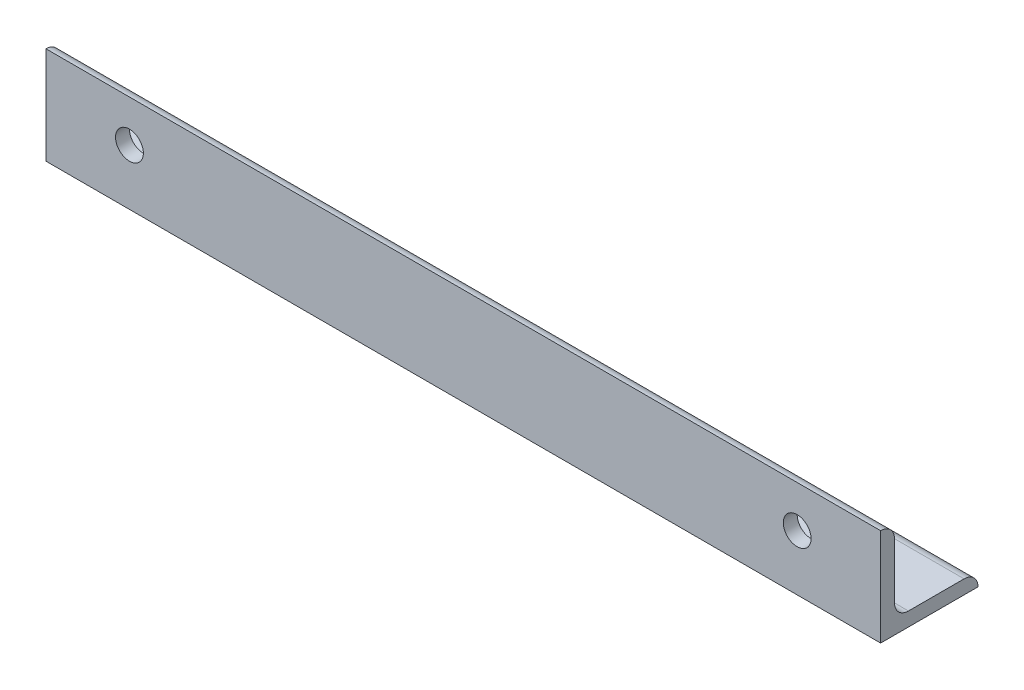
ISO-10303-21;
HEADER;
FILE_DESCRIPTION(('STEP AP214'),'2;1');
FILE_NAME('part.step','',(''),(''),'','','');
FILE_SCHEMA(('AUTOMOTIVE_DESIGN { 1 0 10303 214 1 1 1 1 }'));
ENDSEC;
DATA;
#1=APPLICATION_CONTEXT('core data for automotive mechanical design processes');
#2=APPLICATION_PROTOCOL_DEFINITION('international standard','automotive_design',2000,#1);
#3=PRODUCT_CONTEXT('',#1,'mechanical');
#4=PRODUCT('Part','Part','',(#3));
#5=PRODUCT_RELATED_PRODUCT_CATEGORY('part','',(#4));
#6=PRODUCT_DEFINITION_FORMATION('','',#4);
#7=PRODUCT_DEFINITION_CONTEXT('part definition',#1,'design');
#8=PRODUCT_DEFINITION('design','',#6,#7);
#9=PRODUCT_DEFINITION_SHAPE('','',#8);
#10=(LENGTH_UNIT() NAMED_UNIT(*) SI_UNIT(.MILLI.,.METRE.));
#11=(NAMED_UNIT(*) PLANE_ANGLE_UNIT() SI_UNIT($,.RADIAN.));
#12=(NAMED_UNIT(*) SI_UNIT($,.STERADIAN.) SOLID_ANGLE_UNIT());
#13=UNCERTAINTY_MEASURE_WITH_UNIT(LENGTH_MEASURE(1.E-05),#10,'distance_accuracy_value','');
#14=(GEOMETRIC_REPRESENTATION_CONTEXT(3) GLOBAL_UNCERTAINTY_ASSIGNED_CONTEXT((#13)) GLOBAL_UNIT_ASSIGNED_CONTEXT((#10,
#11,#12)) REPRESENTATION_CONTEXT('',''));
#15=CARTESIAN_POINT('',(0.,0.,0.));
#16=DIRECTION('',(0.,0.,1.));
#17=DIRECTION('',(1.,0.,0.));
#18=AXIS2_PLACEMENT_3D('',#15,#16,#17);
#19=CARTESIAN_POINT('',(300.,0.,-35.));
#20=DIRECTION('',(0.,1.,0.));
#21=DIRECTION('',(0.,0.,1.));
#22=AXIS2_PLACEMENT_3D('',#19,#20,#21);
#23=PLANE('',#22);
#24=DIRECTION('',(0.,0.,-1.));
#25=VECTOR('',#24,1.);
#26=CARTESIAN_POINT('',(0.,0.,-35.));
#27=LINE('',#26,#25);
#28=CARTESIAN_POINT('',(0.,0.,0.));
#29=VERTEX_POINT('',#28);
#30=CARTESIAN_POINT('',(0.,0.,-35.));
#31=VERTEX_POINT('',#30);
#32=EDGE_CURVE('E154',#29,#31,#27,.T.);
#33=ORIENTED_EDGE('',*,*,#32,.T.);
#34=DIRECTION('',(-1.,0.,0.));
#35=VECTOR('',#34,1.);
#36=CARTESIAN_POINT('',(300.,0.,-35.));
#37=LINE('',#36,#35);
#38=CARTESIAN_POINT('',(300.,0.,-35.));
#39=VERTEX_POINT('',#38);
#40=EDGE_CURVE('E13',#39,#31,#37,.T.);
#41=ORIENTED_EDGE('',*,*,#40,.F.);
#42=DIRECTION('',(0.,0.,-1.));
#43=VECTOR('',#42,1.);
#44=CARTESIAN_POINT('',(300.,0.,-35.));
#45=LINE('',#44,#43);
#46=CARTESIAN_POINT('',(300.,0.,0.));
#47=VERTEX_POINT('',#46);
#48=EDGE_CURVE('E167',#47,#39,#45,.T.);
#49=ORIENTED_EDGE('',*,*,#48,.F.);
#50=DIRECTION('',(-1.,0.,0.));
#51=VECTOR('',#50,1.);
#52=CARTESIAN_POINT('',(300.,0.,0.));
#53=LINE('',#52,#51);
#54=EDGE_CURVE('E150',#47,#29,#53,.T.);
#55=ORIENTED_EDGE('',*,*,#54,.T.);
#56=EDGE_LOOP('',(#33,#41,#49,#55));
#57=FACE_BOUND('',#56,.T.);
#58=ADVANCED_FACE('F64',(#57),#23,.F.);
#59=CARTESIAN_POINT('',(300.,0.,-30.));
#60=DIRECTION('',(-1.,0.,0.));
#61=DIRECTION('',(0.,0.,1.));
#62=AXIS2_PLACEMENT_3D('',#59,#60,#61);
#63=CYLINDRICAL_SURFACE('',#62,5.);
#64=CARTESIAN_POINT('',(0.,0.,-30.));
#65=DIRECTION('',(1.,0.,0.));
#66=DIRECTION('',(0.,0.,-1.));
#67=AXIS2_PLACEMENT_3D('',#64,#65,#66);
#68=CIRCLE('',#67,5.);
#69=CARTESIAN_POINT('',(0.,5.,-30.));
#70=VERTEX_POINT('',#69);
#71=EDGE_CURVE('E157',#31,#70,#68,.T.);
#72=ORIENTED_EDGE('',*,*,#71,.T.);
#73=DIRECTION('',(-1.,0.,0.));
#74=VECTOR('',#73,1.);
#75=CARTESIAN_POINT('',(300.,5.,-30.));
#76=LINE('',#75,#74);
#77=CARTESIAN_POINT('',(300.,5.,-30.));
#78=VERTEX_POINT('',#77);
#79=EDGE_CURVE('E72',#78,#70,#76,.T.);
#80=ORIENTED_EDGE('',*,*,#79,.F.);
#81=CARTESIAN_POINT('',(300.,0.,-30.));
#82=DIRECTION('',(1.,0.,0.));
#83=DIRECTION('',(0.,0.,-1.));
#84=AXIS2_PLACEMENT_3D('',#81,#82,#83);
#85=CIRCLE('',#84,5.);
#86=EDGE_CURVE('E120',#39,#78,#85,.T.);
#87=ORIENTED_EDGE('',*,*,#86,.F.);
#88=ORIENTED_EDGE('',*,*,#40,.T.);
#89=EDGE_LOOP('',(#72,#80,#87,#88));
#90=FACE_BOUND('',#89,.T.);
#91=ADVANCED_FACE('F227',(#90),#63,.T.);
#92=CARTESIAN_POINT('',(300.,5.,-10.));
#93=DIRECTION('',(0.,-1.,0.));
#94=DIRECTION('',(0.,0.,-1.));
#95=AXIS2_PLACEMENT_3D('',#92,#93,#94);
#96=PLANE('',#95);
#97=DIRECTION('',(0.,0.,1.));
#98=VECTOR('',#97,1.);
#99=CARTESIAN_POINT('',(0.,5.,-10.));
#100=LINE('',#99,#98);
#101=CARTESIAN_POINT('',(0.,5.,-10.));
#102=VERTEX_POINT('',#101);
#103=EDGE_CURVE('E160',#70,#102,#100,.T.);
#104=ORIENTED_EDGE('',*,*,#103,.T.);
#105=DIRECTION('',(-1.,0.,0.));
#106=VECTOR('',#105,1.);
#107=CARTESIAN_POINT('',(300.,5.,-10.));
#108=LINE('',#107,#106);
#109=CARTESIAN_POINT('',(300.,5.,-10.));
#110=VERTEX_POINT('',#109);
#111=EDGE_CURVE('E171',#110,#102,#108,.T.);
#112=ORIENTED_EDGE('',*,*,#111,.F.);
#113=DIRECTION('',(0.,0.,1.));
#114=VECTOR('',#113,1.);
#115=CARTESIAN_POINT('',(300.,5.,-10.));
#116=LINE('',#115,#114);
#117=EDGE_CURVE('E179',#78,#110,#116,.T.);
#118=ORIENTED_EDGE('',*,*,#117,.F.);
#119=ORIENTED_EDGE('',*,*,#79,.T.);
#120=EDGE_LOOP('',(#104,#112,#118,#119));
#121=FACE_BOUND('',#120,.T.);
#122=ADVANCED_FACE('F177',(#121),#96,.F.);
#123=CARTESIAN_POINT('',(300.,10.,-10.));
#124=DIRECTION('',(-1.,0.,0.));
#125=DIRECTION('',(0.,0.,1.));
#126=AXIS2_PLACEMENT_3D('',#123,#124,#125);
#127=CYLINDRICAL_SURFACE('',#126,5.);
#128=CARTESIAN_POINT('',(0.,10.,-10.));
#129=DIRECTION('',(-1.,0.,0.));
#130=DIRECTION('',(0.,0.,1.));
#131=AXIS2_PLACEMENT_3D('',#128,#129,#130);
#132=CIRCLE('',#131,5.);
#133=CARTESIAN_POINT('',(0.,10.,-5.));
#134=VERTEX_POINT('',#133);
#135=EDGE_CURVE('E162',#102,#134,#132,.T.);
#136=ORIENTED_EDGE('',*,*,#135,.T.);
#137=DIRECTION('',(-1.,0.,0.));
#138=VECTOR('',#137,1.);
#139=CARTESIAN_POINT('',(300.,10.,-5.));
#140=LINE('',#139,#138);
#141=CARTESIAN_POINT('',(300.,10.,-5.));
#142=VERTEX_POINT('',#141);
#143=EDGE_CURVE('E145',#142,#134,#140,.T.);
#144=ORIENTED_EDGE('',*,*,#143,.F.);
#145=CARTESIAN_POINT('',(300.,10.,-10.));
#146=DIRECTION('',(-1.,0.,0.));
#147=DIRECTION('',(0.,0.,1.));
#148=AXIS2_PLACEMENT_3D('',#145,#146,#147);
#149=CIRCLE('',#148,5.);
#150=EDGE_CURVE('E136',#110,#142,#149,.T.);
#151=ORIENTED_EDGE('',*,*,#150,.F.);
#152=ORIENTED_EDGE('',*,*,#111,.T.);
#153=EDGE_LOOP('',(#136,#144,#151,#152));
#154=FACE_BOUND('',#153,.T.);
#155=ADVANCED_FACE('F185',(#154),#127,.F.);
#156=CARTESIAN_POINT('',(300.,30.,-5.));
#157=DIRECTION('',(0.,0.,1.));
#158=DIRECTION('',(0.,-1.,0.));
#159=AXIS2_PLACEMENT_3D('',#156,#157,#158);
#160=PLANE('',#159);
#161=CARTESIAN_POINT('',(270.,20.,-5.));
#162=DIRECTION('',(0.,0.,-1.));
#163=DIRECTION('',(0.,1.,0.));
#164=AXIS2_PLACEMENT_3D('',#161,#162,#163);
#165=CIRCLE('',#164,4.99999999999999);
#166=CARTESIAN_POINT('',(270.,25.,-5.));
#167=VERTEX_POINT('',#166);
#168=EDGE_CURVE('E196',#167,#167,#165,.T.);
#169=ORIENTED_EDGE('',*,*,#168,.F.);
#170=EDGE_LOOP('',(#169));
#171=FACE_BOUND('',#170,.T.);
#172=CARTESIAN_POINT('',(30.,20.,-5.));
#173=DIRECTION('',(0.,0.,-1.));
#174=DIRECTION('',(0.,1.,0.));
#175=AXIS2_PLACEMENT_3D('',#172,#173,#174);
#176=CIRCLE('',#175,5.);
#177=CARTESIAN_POINT('',(30.,25.,-5.));
#178=VERTEX_POINT('',#177);
#179=EDGE_CURVE('E190',#178,#178,#176,.T.);
#180=ORIENTED_EDGE('',*,*,#179,.F.);
#181=EDGE_LOOP('',(#180));
#182=FACE_BOUND('',#181,.T.);
#183=DIRECTION('',(0.,1.,0.));
#184=VECTOR('',#183,1.);
#185=CARTESIAN_POINT('',(0.,30.,-5.));
#186=LINE('',#185,#184);
#187=CARTESIAN_POINT('',(0.,30.,-5.));
#188=VERTEX_POINT('',#187);
#189=EDGE_CURVE('E144',#134,#188,#186,.T.);
#190=ORIENTED_EDGE('',*,*,#189,.T.);
#191=DIRECTION('',(-1.,0.,0.));
#192=VECTOR('',#191,1.);
#193=CARTESIAN_POINT('',(300.,30.,-5.));
#194=LINE('',#193,#192);
#195=CARTESIAN_POINT('',(300.,30.,-5.));
#196=VERTEX_POINT('',#195);
#197=EDGE_CURVE('E141',#196,#188,#194,.T.);
#198=ORIENTED_EDGE('',*,*,#197,.F.);
#199=DIRECTION('',(0.,1.,0.));
#200=VECTOR('',#199,1.);
#201=CARTESIAN_POINT('',(300.,30.,-5.));
#202=LINE('',#201,#200);
#203=EDGE_CURVE('E130',#142,#196,#202,.T.);
#204=ORIENTED_EDGE('',*,*,#203,.F.);
#205=ORIENTED_EDGE('',*,*,#143,.T.);
#206=EDGE_LOOP('',(#190,#198,#204,#205));
#207=FACE_BOUND('',#206,.T.);
#208=ADVANCED_FACE('F142',(#171,#182,#207),#160,.F.);
#209=CARTESIAN_POINT('',(300.,30.,0.));
#210=DIRECTION('',(-1.,0.,0.));
#211=DIRECTION('',(0.,0.,1.));
#212=AXIS2_PLACEMENT_3D('',#209,#210,#211);
#213=CYLINDRICAL_SURFACE('',#212,5.);
#214=CARTESIAN_POINT('',(0.,30.,0.));
#215=DIRECTION('',(1.,0.,0.));
#216=DIRECTION('',(0.,0.,1.));
#217=AXIS2_PLACEMENT_3D('',#214,#215,#216);
#218=CIRCLE('',#217,5.);
#219=CARTESIAN_POINT('',(0.,35.,0.));
#220=VERTEX_POINT('',#219);
#221=EDGE_CURVE('E106',#188,#220,#218,.T.);
#222=ORIENTED_EDGE('',*,*,#221,.T.);
#223=DIRECTION('',(-1.,0.,0.));
#224=VECTOR('',#223,1.);
#225=CARTESIAN_POINT('',(300.,35.,0.));
#226=LINE('',#225,#224);
#227=CARTESIAN_POINT('',(300.,35.,0.));
#228=VERTEX_POINT('',#227);
#229=EDGE_CURVE('E146',#228,#220,#226,.T.);
#230=ORIENTED_EDGE('',*,*,#229,.F.);
#231=CARTESIAN_POINT('',(300.,30.,0.));
#232=DIRECTION('',(1.,0.,0.));
#233=DIRECTION('',(0.,0.,1.));
#234=AXIS2_PLACEMENT_3D('',#231,#232,#233);
#235=CIRCLE('',#234,5.);
#236=EDGE_CURVE('E134',#196,#228,#235,.T.);
#237=ORIENTED_EDGE('',*,*,#236,.F.);
#238=ORIENTED_EDGE('',*,*,#197,.T.);
#239=EDGE_LOOP('',(#222,#230,#237,#238));
#240=FACE_BOUND('',#239,.T.);
#241=ADVANCED_FACE('F148',(#240),#213,.T.);
#242=CARTESIAN_POINT('',(300.,0.,0.));
#243=DIRECTION('',(0.,0.,-1.));
#244=DIRECTION('',(-1.,0.,0.));
#245=AXIS2_PLACEMENT_3D('',#242,#243,#244);
#246=PLANE('',#245);
#247=CARTESIAN_POINT('',(270.,20.,0.));
#248=DIRECTION('',(0.,0.,-1.));
#249=DIRECTION('',(0.,1.,0.));
#250=AXIS2_PLACEMENT_3D('',#247,#248,#249);
#251=CIRCLE('',#250,4.99999999999999);
#252=CARTESIAN_POINT('',(270.,25.,0.));
#253=VERTEX_POINT('',#252);
#254=EDGE_CURVE('E158',#253,#253,#251,.T.);
#255=ORIENTED_EDGE('',*,*,#254,.T.);
#256=EDGE_LOOP('',(#255));
#257=FACE_BOUND('',#256,.T.);
#258=CARTESIAN_POINT('',(30.,20.,0.));
#259=DIRECTION('',(0.,0.,-1.));
#260=DIRECTION('',(0.,1.,0.));
#261=AXIS2_PLACEMENT_3D('',#258,#259,#260);
#262=CIRCLE('',#261,5.);
#263=CARTESIAN_POINT('',(30.,25.,0.));
#264=VERTEX_POINT('',#263);
#265=EDGE_CURVE('E193',#264,#264,#262,.T.);
#266=ORIENTED_EDGE('',*,*,#265,.T.);
#267=EDGE_LOOP('',(#266));
#268=FACE_BOUND('',#267,.T.);
#269=DIRECTION('',(0.,-1.,0.));
#270=VECTOR('',#269,1.);
#271=CARTESIAN_POINT('',(0.,0.,0.));
#272=LINE('',#271,#270);
#273=EDGE_CURVE('E112',#220,#29,#272,.T.);
#274=ORIENTED_EDGE('',*,*,#273,.T.);
#275=ORIENTED_EDGE('',*,*,#54,.F.);
#276=DIRECTION('',(0.,-1.,0.));
#277=VECTOR('',#276,1.);
#278=CARTESIAN_POINT('',(300.,0.,0.));
#279=LINE('',#278,#277);
#280=EDGE_CURVE('E80',#228,#47,#279,.T.);
#281=ORIENTED_EDGE('',*,*,#280,.F.);
#282=ORIENTED_EDGE('',*,*,#229,.T.);
#283=EDGE_LOOP('',(#274,#275,#281,#282));
#284=FACE_BOUND('',#283,.T.);
#285=ADVANCED_FACE('F202',(#257,#268,#284),#246,.F.);
#286=CARTESIAN_POINT('',(300.,30.,0.));
#287=DIRECTION('',(-1.,0.,0.));
#288=DIRECTION('',(0.,0.,1.));
#289=AXIS2_PLACEMENT_3D('',#286,#287,#288);
#290=PLANE('',#289);
#291=ORIENTED_EDGE('',*,*,#48,.T.);
#292=ORIENTED_EDGE('',*,*,#86,.T.);
#293=ORIENTED_EDGE('',*,*,#117,.T.);
#294=ORIENTED_EDGE('',*,*,#150,.T.);
#295=ORIENTED_EDGE('',*,*,#203,.T.);
#296=ORIENTED_EDGE('',*,*,#236,.T.);
#297=ORIENTED_EDGE('',*,*,#280,.T.);
#298=EDGE_LOOP('',(#291,#292,#293,#294,#295,#296,#297));
#299=FACE_BOUND('',#298,.T.);
#300=ADVANCED_FACE('F132',(#299),#290,.F.);
#301=CARTESIAN_POINT('',(0.,30.,0.));
#302=DIRECTION('',(-1.,0.,0.));
#303=DIRECTION('',(0.,0.,1.));
#304=AXIS2_PLACEMENT_3D('',#301,#302,#303);
#305=PLANE('',#304);
#306=ORIENTED_EDGE('',*,*,#32,.F.);
#307=ORIENTED_EDGE('',*,*,#273,.F.);
#308=ORIENTED_EDGE('',*,*,#221,.F.);
#309=ORIENTED_EDGE('',*,*,#189,.F.);
#310=ORIENTED_EDGE('',*,*,#135,.F.);
#311=ORIENTED_EDGE('',*,*,#103,.F.);
#312=ORIENTED_EDGE('',*,*,#71,.F.);
#313=EDGE_LOOP('',(#306,#307,#308,#309,#310,#311,#312));
#314=FACE_BOUND('',#313,.T.);
#315=ADVANCED_FACE('F183',(#314),#305,.T.);
#316=CARTESIAN_POINT('',(30.,20.,0.));
#317=DIRECTION('',(0.,0.,-1.));
#318=DIRECTION('',(0.,1.,0.));
#319=AXIS2_PLACEMENT_3D('',#316,#317,#318);
#320=CYLINDRICAL_SURFACE('',#319,5.);
#321=ORIENTED_EDGE('',*,*,#265,.F.);
#322=EDGE_LOOP('',(#321));
#323=FACE_BOUND('',#322,.T.);
#324=ORIENTED_EDGE('',*,*,#179,.T.);
#325=EDGE_LOOP('',(#324));
#326=FACE_BOUND('',#325,.T.);
#327=ADVANCED_FACE('F208',(#323,#326),#320,.F.);
#328=CARTESIAN_POINT('',(270.,20.,0.));
#329=DIRECTION('',(0.,0.,-1.));
#330=DIRECTION('',(0.,1.,0.));
#331=AXIS2_PLACEMENT_3D('',#328,#329,#330);
#332=CYLINDRICAL_SURFACE('',#331,4.99999999999999);
#333=ORIENTED_EDGE('',*,*,#254,.F.);
#334=EDGE_LOOP('',(#333));
#335=FACE_BOUND('',#334,.T.);
#336=ORIENTED_EDGE('',*,*,#168,.T.);
#337=EDGE_LOOP('',(#336));
#338=FACE_BOUND('',#337,.T.);
#339=ADVANCED_FACE('F205',(#335,#338),#332,.F.);
#340=CLOSED_SHELL('',(#58,#91,#122,#155,#208,#241,#285,#300,#315,#327,#339));
#341=MANIFOLD_SOLID_BREP('B2',#340);
#342=ADVANCED_BREP_SHAPE_REPRESENTATION('',(#18,#341),#14);
#343=SHAPE_DEFINITION_REPRESENTATION(#9,#342);
ENDSEC;
END-ISO-10303-21;
